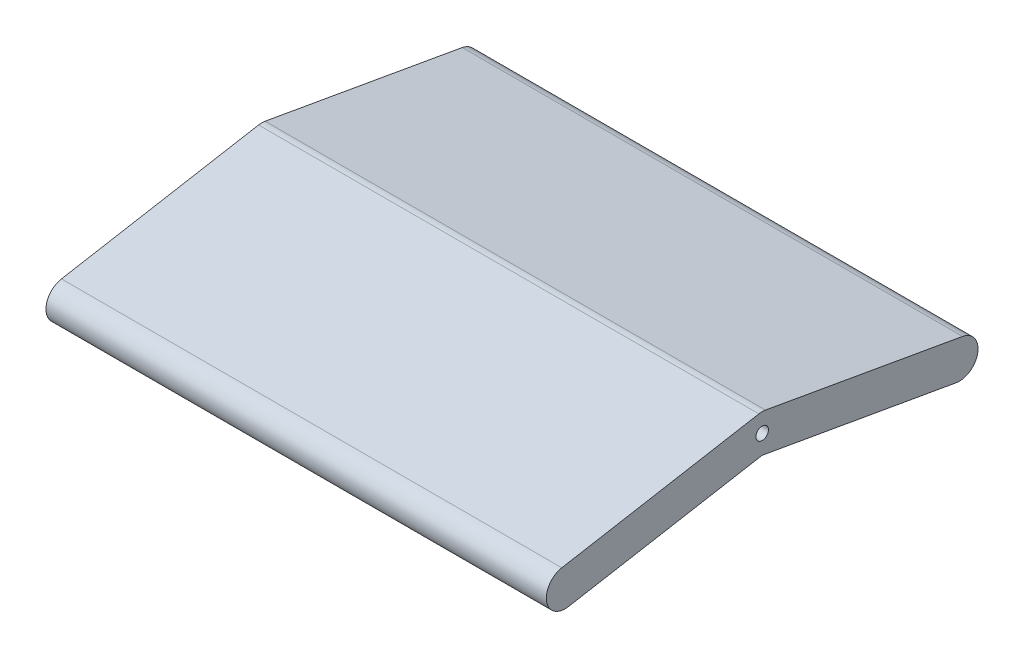
ISO-10303-21;
HEADER;
FILE_DESCRIPTION(('STEP AP214'),'2;1');
FILE_NAME('part.step','',(''),(''),'','','');
FILE_SCHEMA(('AUTOMOTIVE_DESIGN { 1 0 10303 214 1 1 1 1 }'));
ENDSEC;
DATA;
#1=APPLICATION_CONTEXT('core data for automotive mechanical design processes');
#2=APPLICATION_PROTOCOL_DEFINITION('international standard','automotive_design',2000,#1);
#3=PRODUCT_CONTEXT('',#1,'mechanical');
#4=PRODUCT('Part','Part','',(#3));
#5=PRODUCT_RELATED_PRODUCT_CATEGORY('part','',(#4));
#6=PRODUCT_DEFINITION_FORMATION('','',#4);
#7=PRODUCT_DEFINITION_CONTEXT('part definition',#1,'design');
#8=PRODUCT_DEFINITION('design','',#6,#7);
#9=PRODUCT_DEFINITION_SHAPE('','',#8);
#10=(LENGTH_UNIT() NAMED_UNIT(*) SI_UNIT(.MILLI.,.METRE.));
#11=(NAMED_UNIT(*) PLANE_ANGLE_UNIT() SI_UNIT($,.RADIAN.));
#12=(NAMED_UNIT(*) SI_UNIT($,.STERADIAN.) SOLID_ANGLE_UNIT());
#13=UNCERTAINTY_MEASURE_WITH_UNIT(LENGTH_MEASURE(1.E-05),#10,'distance_accuracy_value','');
#14=(GEOMETRIC_REPRESENTATION_CONTEXT(3) GLOBAL_UNCERTAINTY_ASSIGNED_CONTEXT((#13)) GLOBAL_UNIT_ASSIGNED_CONTEXT((#10,
#11,#12)) REPRESENTATION_CONTEXT('',''));
#15=CARTESIAN_POINT('',(0.,0.,0.));
#16=DIRECTION('',(0.,0.,1.));
#17=DIRECTION('',(1.,0.,0.));
#18=AXIS2_PLACEMENT_3D('',#15,#16,#17);
#19=CARTESIAN_POINT('',(10.,-15.3951194723045,11.7215127912978));
#20=DIRECTION('',(1.,0.,0.));
#21=DIRECTION('',(0.,0.,-1.));
#22=AXIS2_PLACEMENT_3D('',#19,#20,#21);
#23=PLANE('',#22);
#24=CARTESIAN_POINT('',(10.,-15.3951194723045,11.7215127912978));
#25=DIRECTION('',(1.,0.,0.));
#26=DIRECTION('',(0.,0.,-1.));
#27=AXIS2_PLACEMENT_3D('',#24,#25,#26);
#28=CIRCLE('',#27,0.375000000000001);
#29=CARTESIAN_POINT('',(10.,-15.0258165649249,11.7866308579229));
#30=VERTEX_POINT('',#29);
#31=CARTESIAN_POINT('',(10.,-15.764422379684,11.6563947246727));
#32=VERTEX_POINT('',#31);
#33=EDGE_CURVE('E137',#30,#32,#28,.T.);
#34=ORIENTED_EDGE('',*,*,#33,.T.);
#35=DIRECTION('',(0.,0.173648177666927,-0.984807753012208));
#36=VECTOR('',#35,1.);
#37=CARTESIAN_POINT('',(10.,-15.764422379684,11.6563947246727));
#38=LINE('',#37,#36);
#39=CARTESIAN_POINT('',(10.,-15.0813117410939,7.78228177924895));
#40=VERTEX_POINT('',#39);
#41=EDGE_CURVE('E90',#32,#40,#38,.T.);
#42=ORIENTED_EDGE('',*,*,#41,.T.);
#43=DIRECTION('',(0.,-0.173648177666927,-0.984807753012209));
#44=VECTOR('',#43,1.);
#45=CARTESIAN_POINT('',(10.,-15.764422379684,3.90816883382521));
#46=LINE('',#45,#44);
#47=CARTESIAN_POINT('',(10.,-15.764422379684,3.90816883382521));
#48=VERTEX_POINT('',#47);
#49=EDGE_CURVE('E149',#40,#48,#46,.T.);
#50=ORIENTED_EDGE('',*,*,#49,.T.);
#51=CARTESIAN_POINT('',(10.,-15.3951194723045,3.84305076720012));
#52=DIRECTION('',(1.,0.,0.));
#53=DIRECTION('',(0.,0.,-1.));
#54=AXIS2_PLACEMENT_3D('',#51,#52,#53);
#55=CIRCLE('',#54,0.375);
#56=CARTESIAN_POINT('',(10.,-15.0258165649249,3.77793270057502));
#57=VERTEX_POINT('',#56);
#58=EDGE_CURVE('E106',#48,#57,#55,.T.);
#59=ORIENTED_EDGE('',*,*,#58,.T.);
#60=DIRECTION('',(0.,0.173648177666927,0.984807753012209));
#61=VECTOR('',#60,1.);
#62=CARTESIAN_POINT('',(10.,-15.0258165649249,3.77793270057502));
#63=LINE('',#62,#61);
#64=CARTESIAN_POINT('',(10.,-14.3312238542572,7.71716371262385));
#65=VERTEX_POINT('',#64);
#66=EDGE_CURVE('E100',#57,#65,#63,.T.);
#67=ORIENTED_EDGE('',*,*,#66,.T.);
#68=CARTESIAN_POINT('',(10.,-14.7005267616368,7.78228177924895));
#69=DIRECTION('',(1.,0.,0.));
#70=DIRECTION('',(0.,0.,-1.));
#71=AXIS2_PLACEMENT_3D('',#68,#69,#70);
#72=CIRCLE('',#71,0.375000000000001);
#73=CARTESIAN_POINT('',(10.,-14.3312238542572,7.84739984587405));
#74=VERTEX_POINT('',#73);
#75=EDGE_CURVE('E104',#65,#74,#72,.T.);
#76=ORIENTED_EDGE('',*,*,#75,.T.);
#77=DIRECTION('',(0.,-0.173648177666927,0.984807753012209));
#78=VECTOR('',#77,1.);
#79=CARTESIAN_POINT('',(10.,-15.0258165649249,11.7866308579229));
#80=LINE('',#79,#78);
#81=EDGE_CURVE('E50',#74,#30,#80,.T.);
#82=ORIENTED_EDGE('',*,*,#81,.T.);
#83=EDGE_LOOP('',(#34,#42,#50,#59,#67,#76,#82));
#84=FACE_BOUND('',#83,.T.);
#85=CARTESIAN_POINT('',(10.,-14.7005267616368,7.78228177924895));
#86=DIRECTION('',(1.,0.,0.));
#87=DIRECTION('',(0.,0.,-1.));
#88=AXIS2_PLACEMENT_3D('',#85,#86,#87);
#89=CIRCLE('',#88,0.125);
#90=CARTESIAN_POINT('',(10.,-14.7005267616368,7.65728177924895));
#91=VERTEX_POINT('',#90);
#92=EDGE_CURVE('E128',#91,#91,#89,.T.);
#93=ORIENTED_EDGE('',*,*,#92,.F.);
#94=EDGE_LOOP('',(#93));
#95=FACE_BOUND('',#94,.T.);
#96=ADVANCED_FACE('F33',(#84,#95),#23,.T.);
#97=CARTESIAN_POINT('',(0.,-15.3951194723045,11.7215127912978));
#98=DIRECTION('',(1.,0.,0.));
#99=DIRECTION('',(0.,0.,-1.));
#100=AXIS2_PLACEMENT_3D('',#97,#98,#99);
#101=PLANE('',#100);
#102=CARTESIAN_POINT('',(0.,-15.3951194723045,11.7215127912978));
#103=DIRECTION('',(1.,0.,0.));
#104=DIRECTION('',(0.,0.,-1.));
#105=AXIS2_PLACEMENT_3D('',#102,#103,#104);
#106=CIRCLE('',#105,0.375000000000001);
#107=CARTESIAN_POINT('',(0.,-15.0258165649249,11.7866308579229));
#108=VERTEX_POINT('',#107);
#109=CARTESIAN_POINT('',(0.,-15.764422379684,11.6563947246727));
#110=VERTEX_POINT('',#109);
#111=EDGE_CURVE('E124',#108,#110,#106,.T.);
#112=ORIENTED_EDGE('',*,*,#111,.F.);
#113=DIRECTION('',(0.,-0.173648177666927,0.984807753012209));
#114=VECTOR('',#113,1.);
#115=CARTESIAN_POINT('',(0.,-15.0258165649249,11.7866308579229));
#116=LINE('',#115,#114);
#117=CARTESIAN_POINT('',(0.,-14.3312238542572,7.84739984587405));
#118=VERTEX_POINT('',#117);
#119=EDGE_CURVE('E82',#118,#108,#116,.T.);
#120=ORIENTED_EDGE('',*,*,#119,.F.);
#121=CARTESIAN_POINT('',(0.,-14.7005267616368,7.78228177924895));
#122=DIRECTION('',(1.,0.,0.));
#123=DIRECTION('',(0.,0.,-1.));
#124=AXIS2_PLACEMENT_3D('',#121,#122,#123);
#125=CIRCLE('',#124,0.375000000000001);
#126=CARTESIAN_POINT('',(0.,-14.3312238542572,7.71716371262385));
#127=VERTEX_POINT('',#126);
#128=EDGE_CURVE('E76',#127,#118,#125,.T.);
#129=ORIENTED_EDGE('',*,*,#128,.F.);
#130=DIRECTION('',(0.,0.173648177666927,0.984807753012209));
#131=VECTOR('',#130,1.);
#132=CARTESIAN_POINT('',(0.,-15.0258165649249,3.77793270057502));
#133=LINE('',#132,#131);
#134=CARTESIAN_POINT('',(0.,-15.0258165649249,3.77793270057502));
#135=VERTEX_POINT('',#134);
#136=EDGE_CURVE('E114',#135,#127,#133,.T.);
#137=ORIENTED_EDGE('',*,*,#136,.F.);
#138=CARTESIAN_POINT('',(0.,-15.3951194723045,3.84305076720012));
#139=DIRECTION('',(1.,0.,0.));
#140=DIRECTION('',(0.,0.,-1.));
#141=AXIS2_PLACEMENT_3D('',#138,#139,#140);
#142=CIRCLE('',#141,0.375);
#143=CARTESIAN_POINT('',(0.,-15.764422379684,3.90816883382521));
#144=VERTEX_POINT('',#143);
#145=EDGE_CURVE('E132',#144,#135,#142,.T.);
#146=ORIENTED_EDGE('',*,*,#145,.F.);
#147=DIRECTION('',(0.,-0.173648177666927,-0.984807753012209));
#148=VECTOR('',#147,1.);
#149=CARTESIAN_POINT('',(0.,-15.764422379684,3.90816883382521));
#150=LINE('',#149,#148);
#151=CARTESIAN_POINT('',(0.,-15.0813117410939,7.78228177924895));
#152=VERTEX_POINT('',#151);
#153=EDGE_CURVE('E130',#152,#144,#150,.T.);
#154=ORIENTED_EDGE('',*,*,#153,.F.);
#155=DIRECTION('',(0.,0.173648177666927,-0.984807753012208));
#156=VECTOR('',#155,1.);
#157=CARTESIAN_POINT('',(0.,-15.764422379684,11.6563947246727));
#158=LINE('',#157,#156);
#159=EDGE_CURVE('E127',#110,#152,#158,.T.);
#160=ORIENTED_EDGE('',*,*,#159,.F.);
#161=EDGE_LOOP('',(#112,#120,#129,#137,#146,#154,#160));
#162=FACE_BOUND('',#161,.T.);
#163=CARTESIAN_POINT('',(0.,-14.7005267616368,7.78228177924895));
#164=DIRECTION('',(1.,0.,0.));
#165=DIRECTION('',(0.,0.,-1.));
#166=AXIS2_PLACEMENT_3D('',#163,#164,#165);
#167=CIRCLE('',#166,0.125);
#168=CARTESIAN_POINT('',(0.,-14.7005267616368,7.65728177924895));
#169=VERTEX_POINT('',#168);
#170=EDGE_CURVE('E161',#169,#169,#167,.T.);
#171=ORIENTED_EDGE('',*,*,#170,.T.);
#172=EDGE_LOOP('',(#171));
#173=FACE_BOUND('',#172,.T.);
#174=ADVANCED_FACE('F153',(#162,#173),#101,.F.);
#175=CARTESIAN_POINT('',(10.,-15.3951194723045,11.7215127912978));
#176=DIRECTION('',(-1.,0.,0.));
#177=DIRECTION('',(0.,0.,1.));
#178=AXIS2_PLACEMENT_3D('',#175,#176,#177);
#179=CYLINDRICAL_SURFACE('',#178,0.375000000000001);
#180=ORIENTED_EDGE('',*,*,#111,.T.);
#181=DIRECTION('',(-1.,0.,0.));
#182=VECTOR('',#181,1.);
#183=CARTESIAN_POINT('',(10.,-15.764422379684,11.6563947246727));
#184=LINE('',#183,#182);
#185=EDGE_CURVE('E11',#32,#110,#184,.T.);
#186=ORIENTED_EDGE('',*,*,#185,.F.);
#187=ORIENTED_EDGE('',*,*,#33,.F.);
#188=DIRECTION('',(-1.,0.,0.));
#189=VECTOR('',#188,1.);
#190=CARTESIAN_POINT('',(10.,-15.0258165649249,11.7866308579229));
#191=LINE('',#190,#189);
#192=EDGE_CURVE('E120',#30,#108,#191,.T.);
#193=ORIENTED_EDGE('',*,*,#192,.T.);
#194=EDGE_LOOP('',(#180,#186,#187,#193));
#195=FACE_BOUND('',#194,.T.);
#196=ADVANCED_FACE('F35',(#195),#179,.T.);
#197=CARTESIAN_POINT('',(10.,-15.764422379684,11.6563947246727));
#198=DIRECTION('',(0.,0.984807753012209,0.173648177666927));
#199=DIRECTION('',(0.,-0.173648177666927,0.984807753012209));
#200=AXIS2_PLACEMENT_3D('',#197,#198,#199);
#201=PLANE('',#200);
#202=ORIENTED_EDGE('',*,*,#159,.T.);
#203=DIRECTION('',(-1.,0.,0.));
#204=VECTOR('',#203,1.);
#205=CARTESIAN_POINT('',(10.,-15.0813117410939,7.78228177924895));
#206=LINE('',#205,#204);
#207=EDGE_CURVE('E42',#40,#152,#206,.T.);
#208=ORIENTED_EDGE('',*,*,#207,.F.);
#209=ORIENTED_EDGE('',*,*,#41,.F.);
#210=ORIENTED_EDGE('',*,*,#185,.T.);
#211=EDGE_LOOP('',(#202,#208,#209,#210));
#212=FACE_BOUND('',#211,.T.);
#213=ADVANCED_FACE('F187',(#212),#201,.F.);
#214=CARTESIAN_POINT('',(10.,-15.764422379684,3.90816883382521));
#215=DIRECTION('',(0.,0.984807753012209,-0.173648177666927));
#216=DIRECTION('',(0.,0.173648177666927,0.984807753012209));
#217=AXIS2_PLACEMENT_3D('',#214,#215,#216);
#218=PLANE('',#217);
#219=ORIENTED_EDGE('',*,*,#153,.T.);
#220=DIRECTION('',(-1.,0.,0.));
#221=VECTOR('',#220,1.);
#222=CARTESIAN_POINT('',(10.,-15.764422379684,3.90816883382521));
#223=LINE('',#222,#221);
#224=EDGE_CURVE('E141',#48,#144,#223,.T.);
#225=ORIENTED_EDGE('',*,*,#224,.F.);
#226=ORIENTED_EDGE('',*,*,#49,.F.);
#227=ORIENTED_EDGE('',*,*,#207,.T.);
#228=EDGE_LOOP('',(#219,#225,#226,#227));
#229=FACE_BOUND('',#228,.T.);
#230=ADVANCED_FACE('F147',(#229),#218,.F.);
#231=CARTESIAN_POINT('',(10.,-15.3951194723045,3.84305076720012));
#232=DIRECTION('',(-1.,0.,0.));
#233=DIRECTION('',(0.,0.,1.));
#234=AXIS2_PLACEMENT_3D('',#231,#232,#233);
#235=CYLINDRICAL_SURFACE('',#234,0.375);
#236=ORIENTED_EDGE('',*,*,#145,.T.);
#237=DIRECTION('',(-1.,0.,0.));
#238=VECTOR('',#237,1.);
#239=CARTESIAN_POINT('',(10.,-15.0258165649249,3.77793270057502));
#240=LINE('',#239,#238);
#241=EDGE_CURVE('E115',#57,#135,#240,.T.);
#242=ORIENTED_EDGE('',*,*,#241,.F.);
#243=ORIENTED_EDGE('',*,*,#58,.F.);
#244=ORIENTED_EDGE('',*,*,#224,.T.);
#245=EDGE_LOOP('',(#236,#242,#243,#244));
#246=FACE_BOUND('',#245,.T.);
#247=ADVANCED_FACE('F156',(#246),#235,.T.);
#248=CARTESIAN_POINT('',(10.,-15.0258165649249,3.77793270057502));
#249=DIRECTION('',(0.,-0.984807753012209,0.173648177666927));
#250=DIRECTION('',(0.,-0.173648177666927,-0.984807753012209));
#251=AXIS2_PLACEMENT_3D('',#248,#249,#250);
#252=PLANE('',#251);
#253=ORIENTED_EDGE('',*,*,#136,.T.);
#254=DIRECTION('',(-1.,0.,0.));
#255=VECTOR('',#254,1.);
#256=CARTESIAN_POINT('',(10.,-14.3312238542572,7.71716371262385));
#257=LINE('',#256,#255);
#258=EDGE_CURVE('E111',#65,#127,#257,.T.);
#259=ORIENTED_EDGE('',*,*,#258,.F.);
#260=ORIENTED_EDGE('',*,*,#66,.F.);
#261=ORIENTED_EDGE('',*,*,#241,.T.);
#262=EDGE_LOOP('',(#253,#259,#260,#261));
#263=FACE_BOUND('',#262,.T.);
#264=ADVANCED_FACE('F112',(#263),#252,.F.);
#265=CARTESIAN_POINT('',(10.,-14.7005267616368,7.78228177924895));
#266=DIRECTION('',(-1.,0.,0.));
#267=DIRECTION('',(0.,0.,1.));
#268=AXIS2_PLACEMENT_3D('',#265,#266,#267);
#269=CYLINDRICAL_SURFACE('',#268,0.375000000000001);
#270=ORIENTED_EDGE('',*,*,#128,.T.);
#271=DIRECTION('',(-1.,0.,0.));
#272=VECTOR('',#271,1.);
#273=CARTESIAN_POINT('',(10.,-14.3312238542572,7.84739984587405));
#274=LINE('',#273,#272);
#275=EDGE_CURVE('E116',#74,#118,#274,.T.);
#276=ORIENTED_EDGE('',*,*,#275,.F.);
#277=ORIENTED_EDGE('',*,*,#75,.F.);
#278=ORIENTED_EDGE('',*,*,#258,.T.);
#279=EDGE_LOOP('',(#270,#276,#277,#278));
#280=FACE_BOUND('',#279,.T.);
#281=ADVANCED_FACE('F118',(#280),#269,.T.);
#282=CARTESIAN_POINT('',(10.,-15.0258165649249,11.7866308579229));
#283=DIRECTION('',(0.,-0.984807753012209,-0.173648177666927));
#284=DIRECTION('',(0.,0.173648177666927,-0.984807753012209));
#285=AXIS2_PLACEMENT_3D('',#282,#283,#284);
#286=PLANE('',#285);
#287=ORIENTED_EDGE('',*,*,#119,.T.);
#288=ORIENTED_EDGE('',*,*,#192,.F.);
#289=ORIENTED_EDGE('',*,*,#81,.F.);
#290=ORIENTED_EDGE('',*,*,#275,.T.);
#291=EDGE_LOOP('',(#287,#288,#289,#290));
#292=FACE_BOUND('',#291,.T.);
#293=ADVANCED_FACE('F177',(#292),#286,.F.);
#294=CARTESIAN_POINT('',(10.,-14.7005267616368,7.78228177924895));
#295=DIRECTION('',(-1.,0.,0.));
#296=DIRECTION('',(0.,0.,1.));
#297=AXIS2_PLACEMENT_3D('',#294,#295,#296);
#298=CYLINDRICAL_SURFACE('',#297,0.125);
#299=ORIENTED_EDGE('',*,*,#92,.T.);
#300=EDGE_LOOP('',(#299));
#301=FACE_BOUND('',#300,.T.);
#302=ORIENTED_EDGE('',*,*,#170,.F.);
#303=EDGE_LOOP('',(#302));
#304=FACE_BOUND('',#303,.T.);
#305=ADVANCED_FACE('F167',(#301,#304),#298,.F.);
#306=CLOSED_SHELL('',(#96,#174,#196,#213,#230,#247,#264,#281,#293,#305));
#307=MANIFOLD_SOLID_BREP('B2',#306);
#308=ADVANCED_BREP_SHAPE_REPRESENTATION('',(#18,#307),#14);
#309=SHAPE_DEFINITION_REPRESENTATION(#9,#308);
ENDSEC;
END-ISO-10303-21;
